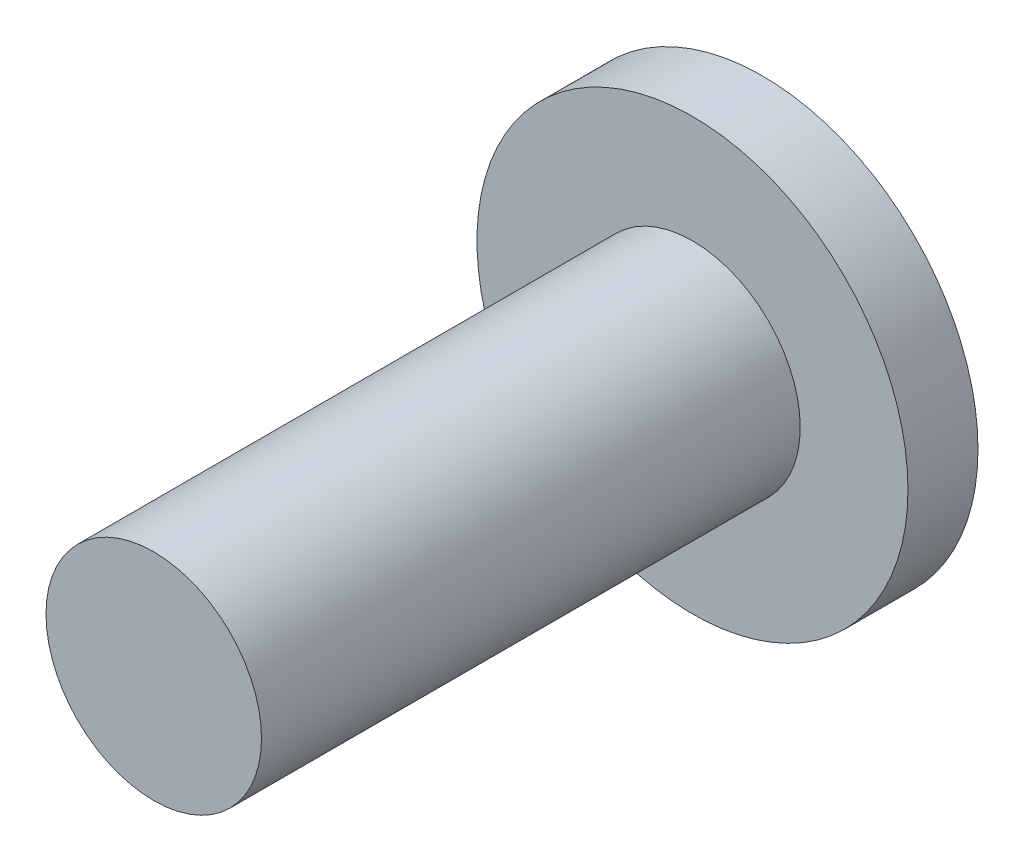
ISO-10303-21;
HEADER;
FILE_DESCRIPTION(('STEP AP214'),'2;1');
FILE_NAME('part.step','',(''),(''),'','','');
FILE_SCHEMA(('AUTOMOTIVE_DESIGN { 1 0 10303 214 1 1 1 1 }'));
ENDSEC;
DATA;
#1=APPLICATION_CONTEXT('core data for automotive mechanical design processes');
#2=APPLICATION_PROTOCOL_DEFINITION('international standard','automotive_design',2000,#1);
#3=PRODUCT_CONTEXT('',#1,'mechanical');
#4=PRODUCT('Part','Part','',(#3));
#5=PRODUCT_RELATED_PRODUCT_CATEGORY('part','',(#4));
#6=PRODUCT_DEFINITION_FORMATION('','',#4);
#7=PRODUCT_DEFINITION_CONTEXT('part definition',#1,'design');
#8=PRODUCT_DEFINITION('design','',#6,#7);
#9=PRODUCT_DEFINITION_SHAPE('','',#8);
#10=(LENGTH_UNIT() NAMED_UNIT(*) SI_UNIT(.MILLI.,.METRE.));
#11=(NAMED_UNIT(*) PLANE_ANGLE_UNIT() SI_UNIT($,.RADIAN.));
#12=(NAMED_UNIT(*) SI_UNIT($,.STERADIAN.) SOLID_ANGLE_UNIT());
#13=UNCERTAINTY_MEASURE_WITH_UNIT(LENGTH_MEASURE(1.E-05),#10,'distance_accuracy_value','');
#14=(GEOMETRIC_REPRESENTATION_CONTEXT(3) GLOBAL_UNCERTAINTY_ASSIGNED_CONTEXT((#13)) GLOBAL_UNIT_ASSIGNED_CONTEXT((#10,
#11,#12)) REPRESENTATION_CONTEXT('',''));
#15=CARTESIAN_POINT('',(0.,0.,0.));
#16=DIRECTION('',(0.,0.,1.));
#17=DIRECTION('',(1.,0.,0.));
#18=AXIS2_PLACEMENT_3D('',#15,#16,#17);
#19=CARTESIAN_POINT('',(0.,0.,1.3));
#20=DIRECTION('',(0.,0.,-1.));
#21=DIRECTION('',(-1.,0.,0.));
#22=AXIS2_PLACEMENT_3D('',#19,#20,#21);
#23=CYLINDRICAL_SURFACE('',#22,4.);
#24=CARTESIAN_POINT('',(0.,0.,1.3));
#25=DIRECTION('',(0.,0.,1.));
#26=DIRECTION('',(1.,0.,0.));
#27=AXIS2_PLACEMENT_3D('',#24,#25,#26);
#28=CIRCLE('',#27,4.);
#29=CARTESIAN_POINT('',(4.,0.,1.3));
#30=VERTEX_POINT('',#29);
#31=EDGE_CURVE('E51',#30,#30,#28,.T.);
#32=ORIENTED_EDGE('',*,*,#31,.F.);
#33=EDGE_LOOP('',(#32));
#34=FACE_BOUND('',#33,.T.);
#35=CARTESIAN_POINT('',(0.,0.,0.));
#36=DIRECTION('',(0.,0.,1.));
#37=DIRECTION('',(1.,0.,0.));
#38=AXIS2_PLACEMENT_3D('',#35,#36,#37);
#39=CIRCLE('',#38,4.);
#40=CARTESIAN_POINT('',(4.,0.,0.));
#41=VERTEX_POINT('',#40);
#42=EDGE_CURVE('E46',#41,#41,#39,.T.);
#43=ORIENTED_EDGE('',*,*,#42,.T.);
#44=EDGE_LOOP('',(#43));
#45=FACE_BOUND('',#44,.T.);
#46=ADVANCED_FACE('F43',(#34,#45),#23,.T.);
#47=CARTESIAN_POINT('',(0.,0.,1.3));
#48=DIRECTION('',(0.,0.,1.));
#49=DIRECTION('',(1.,0.,0.));
#50=AXIS2_PLACEMENT_3D('',#47,#48,#49);
#51=PLANE('',#50);
#52=CARTESIAN_POINT('',(0.,0.,1.3));
#53=DIRECTION('',(0.,0.,1.));
#54=DIRECTION('',(1.,0.,0.));
#55=AXIS2_PLACEMENT_3D('',#52,#53,#54);
#56=CIRCLE('',#55,2.);
#57=CARTESIAN_POINT('',(2.,0.,1.3));
#58=VERTEX_POINT('',#57);
#59=EDGE_CURVE('E11',#58,#58,#56,.T.);
#60=ORIENTED_EDGE('',*,*,#59,.F.);
#61=EDGE_LOOP('',(#60));
#62=FACE_BOUND('',#61,.T.);
#63=ORIENTED_EDGE('',*,*,#31,.T.);
#64=EDGE_LOOP('',(#63));
#65=FACE_BOUND('',#64,.T.);
#66=ADVANCED_FACE('F163',(#62,#65),#51,.T.);
#67=CARTESIAN_POINT('',(0.,0.,0.));
#68=DIRECTION('',(0.,0.,1.));
#69=DIRECTION('',(1.,0.,0.));
#70=AXIS2_PLACEMENT_3D('',#67,#68,#69);
#71=PLANE('',#70);
#72=DIRECTION('',(0.5,0.866025403784439,0.));
#73=VECTOR('',#72,1.);
#74=CARTESIAN_POINT('',(-1.44337567297406,0.,0.));
#75=LINE('',#74,#73);
#76=CARTESIAN_POINT('',(-1.44337567297406,0.,0.));
#77=VERTEX_POINT('',#76);
#78=CARTESIAN_POINT('',(-0.721687836487032,1.25,0.));
#79=VERTEX_POINT('',#78);
#80=EDGE_CURVE('E133',#77,#79,#75,.T.);
#81=ORIENTED_EDGE('',*,*,#80,.F.);
#82=DIRECTION('',(-0.5,0.866025403784439,0.));
#83=VECTOR('',#82,1.);
#84=CARTESIAN_POINT('',(-0.721687836487032,-1.25,0.));
#85=LINE('',#84,#83);
#86=CARTESIAN_POINT('',(-0.721687836487032,-1.25,0.));
#87=VERTEX_POINT('',#86);
#88=EDGE_CURVE('E59',#87,#77,#85,.T.);
#89=ORIENTED_EDGE('',*,*,#88,.F.);
#90=DIRECTION('',(-1.,0.,0.));
#91=VECTOR('',#90,1.);
#92=CARTESIAN_POINT('',(0.721687836487033,-1.25,0.));
#93=LINE('',#92,#91);
#94=CARTESIAN_POINT('',(0.721687836487033,-1.25,0.));
#95=VERTEX_POINT('',#94);
#96=EDGE_CURVE('E142',#95,#87,#93,.T.);
#97=ORIENTED_EDGE('',*,*,#96,.F.);
#98=DIRECTION('',(-0.5,-0.866025403784439,0.));
#99=VECTOR('',#98,1.);
#100=CARTESIAN_POINT('',(1.44337567297406,0.,0.));
#101=LINE('',#100,#99);
#102=CARTESIAN_POINT('',(1.44337567297406,0.,0.));
#103=VERTEX_POINT('',#102);
#104=EDGE_CURVE('E140',#103,#95,#101,.T.);
#105=ORIENTED_EDGE('',*,*,#104,.F.);
#106=DIRECTION('',(0.5,-0.866025403784439,0.));
#107=VECTOR('',#106,1.);
#108=CARTESIAN_POINT('',(0.721687836487033,1.25,0.));
#109=LINE('',#108,#107);
#110=CARTESIAN_POINT('',(0.721687836487033,1.25,0.));
#111=VERTEX_POINT('',#110);
#112=EDGE_CURVE('E107',#111,#103,#109,.T.);
#113=ORIENTED_EDGE('',*,*,#112,.F.);
#114=DIRECTION('',(1.,0.,0.));
#115=VECTOR('',#114,1.);
#116=CARTESIAN_POINT('',(-0.721687836487032,1.25,0.));
#117=LINE('',#116,#115);
#118=EDGE_CURVE('E136',#79,#111,#117,.T.);
#119=ORIENTED_EDGE('',*,*,#118,.F.);
#120=EDGE_LOOP('',(#81,#89,#97,#105,#113,#119));
#121=FACE_BOUND('',#120,.T.);
#122=ORIENTED_EDGE('',*,*,#42,.F.);
#123=EDGE_LOOP('',(#122));
#124=FACE_BOUND('',#123,.T.);
#125=ADVANCED_FACE('F160',(#121,#124),#71,.F.);
#126=CARTESIAN_POINT('',(0.,0.,11.3));
#127=DIRECTION('',(0.,0.,-1.));
#128=DIRECTION('',(-1.,0.,0.));
#129=AXIS2_PLACEMENT_3D('',#126,#127,#128);
#130=CYLINDRICAL_SURFACE('',#129,2.);
#131=CARTESIAN_POINT('',(0.,0.,11.3));
#132=DIRECTION('',(0.,0.,1.));
#133=DIRECTION('',(1.,0.,0.));
#134=AXIS2_PLACEMENT_3D('',#131,#132,#133);
#135=CIRCLE('',#134,2.);
#136=CARTESIAN_POINT('',(2.,0.,11.3));
#137=VERTEX_POINT('',#136);
#138=EDGE_CURVE('E146',#137,#137,#135,.T.);
#139=ORIENTED_EDGE('',*,*,#138,.F.);
#140=EDGE_LOOP('',(#139));
#141=FACE_BOUND('',#140,.T.);
#142=ORIENTED_EDGE('',*,*,#59,.T.);
#143=EDGE_LOOP('',(#142));
#144=FACE_BOUND('',#143,.T.);
#145=ADVANCED_FACE('F162',(#141,#144),#130,.T.);
#146=CARTESIAN_POINT('',(0.,0.,11.3));
#147=DIRECTION('',(0.,0.,1.));
#148=DIRECTION('',(1.,0.,0.));
#149=AXIS2_PLACEMENT_3D('',#146,#147,#148);
#150=PLANE('',#149);
#151=ORIENTED_EDGE('',*,*,#138,.T.);
#152=EDGE_LOOP('',(#151));
#153=FACE_BOUND('',#152,.T.);
#154=ADVANCED_FACE('F170',(#153),#150,.T.);
#155=CARTESIAN_POINT('',(-0.721687836487032,-1.25,1.));
#156=DIRECTION('',(-0.866025403784439,-0.5,0.));
#157=DIRECTION('',(0.5,-0.866025403784439,0.));
#158=AXIS2_PLACEMENT_3D('',#155,#156,#157);
#159=PLANE('',#158);
#160=ORIENTED_EDGE('',*,*,#88,.T.);
#161=DIRECTION('',(0.,0.,-1.));
#162=VECTOR('',#161,1.);
#163=CARTESIAN_POINT('',(-1.44337567297406,0.,1.));
#164=LINE('',#163,#162);
#165=CARTESIAN_POINT('',(-1.44337567297406,0.,1.));
#166=VERTEX_POINT('',#165);
#167=EDGE_CURVE('E89',#166,#77,#164,.T.);
#168=ORIENTED_EDGE('',*,*,#167,.F.);
#169=DIRECTION('',(-0.5,0.866025403784439,0.));
#170=VECTOR('',#169,1.);
#171=CARTESIAN_POINT('',(-0.721687836487032,-1.25,1.));
#172=LINE('',#171,#170);
#173=CARTESIAN_POINT('',(-0.721687836487032,-1.25,1.));
#174=VERTEX_POINT('',#173);
#175=EDGE_CURVE('E144',#174,#166,#172,.T.);
#176=ORIENTED_EDGE('',*,*,#175,.F.);
#177=DIRECTION('',(0.,0.,-1.));
#178=VECTOR('',#177,1.);
#179=CARTESIAN_POINT('',(-0.721687836487032,-1.25,1.));
#180=LINE('',#179,#178);
#181=EDGE_CURVE('E67',#174,#87,#180,.T.);
#182=ORIENTED_EDGE('',*,*,#181,.T.);
#183=EDGE_LOOP('',(#160,#168,#176,#182));
#184=FACE_BOUND('',#183,.T.);
#185=ADVANCED_FACE('F196',(#184),#159,.F.);
#186=CARTESIAN_POINT('',(0.721687836487033,-1.25,1.));
#187=DIRECTION('',(0.,-1.,0.));
#188=DIRECTION('',(0.,0.,-1.));
#189=AXIS2_PLACEMENT_3D('',#186,#187,#188);
#190=PLANE('',#189);
#191=ORIENTED_EDGE('',*,*,#96,.T.);
#192=ORIENTED_EDGE('',*,*,#181,.F.);
#193=DIRECTION('',(-1.,0.,0.));
#194=VECTOR('',#193,1.);
#195=CARTESIAN_POINT('',(0.721687836487033,-1.25,1.));
#196=LINE('',#195,#194);
#197=CARTESIAN_POINT('',(0.721687836487033,-1.25,1.));
#198=VERTEX_POINT('',#197);
#199=EDGE_CURVE('E119',#198,#174,#196,.T.);
#200=ORIENTED_EDGE('',*,*,#199,.F.);
#201=DIRECTION('',(0.,0.,-1.));
#202=VECTOR('',#201,1.);
#203=CARTESIAN_POINT('',(0.721687836487033,-1.25,1.));
#204=LINE('',#203,#202);
#205=EDGE_CURVE('E111',#198,#95,#204,.T.);
#206=ORIENTED_EDGE('',*,*,#205,.T.);
#207=EDGE_LOOP('',(#191,#192,#200,#206));
#208=FACE_BOUND('',#207,.T.);
#209=ADVANCED_FACE('F208',(#208),#190,.F.);
#210=CARTESIAN_POINT('',(1.44337567297406,0.,1.));
#211=DIRECTION('',(0.866025403784439,-0.5,0.));
#212=DIRECTION('',(0.5,0.866025403784439,0.));
#213=AXIS2_PLACEMENT_3D('',#210,#211,#212);
#214=PLANE('',#213);
#215=ORIENTED_EDGE('',*,*,#104,.T.);
#216=ORIENTED_EDGE('',*,*,#205,.F.);
#217=DIRECTION('',(-0.5,-0.866025403784439,0.));
#218=VECTOR('',#217,1.);
#219=CARTESIAN_POINT('',(1.44337567297406,0.,1.));
#220=LINE('',#219,#218);
#221=CARTESIAN_POINT('',(1.44337567297406,0.,1.));
#222=VERTEX_POINT('',#221);
#223=EDGE_CURVE('E115',#222,#198,#220,.T.);
#224=ORIENTED_EDGE('',*,*,#223,.F.);
#225=DIRECTION('',(0.,0.,-1.));
#226=VECTOR('',#225,1.);
#227=CARTESIAN_POINT('',(1.44337567297406,0.,1.));
#228=LINE('',#227,#226);
#229=EDGE_CURVE('E100',#222,#103,#228,.T.);
#230=ORIENTED_EDGE('',*,*,#229,.T.);
#231=EDGE_LOOP('',(#215,#216,#224,#230));
#232=FACE_BOUND('',#231,.T.);
#233=ADVANCED_FACE('F116',(#232),#214,.F.);
#234=CARTESIAN_POINT('',(0.721687836487033,1.25,1.));
#235=DIRECTION('',(0.866025403784439,0.5,0.));
#236=DIRECTION('',(-0.5,0.866025403784439,0.));
#237=AXIS2_PLACEMENT_3D('',#234,#235,#236);
#238=PLANE('',#237);
#239=ORIENTED_EDGE('',*,*,#112,.T.);
#240=ORIENTED_EDGE('',*,*,#229,.F.);
#241=DIRECTION('',(0.5,-0.866025403784439,0.));
#242=VECTOR('',#241,1.);
#243=CARTESIAN_POINT('',(0.721687836487033,1.25,1.));
#244=LINE('',#243,#242);
#245=CARTESIAN_POINT('',(0.721687836487033,1.25,1.));
#246=VERTEX_POINT('',#245);
#247=EDGE_CURVE('E104',#246,#222,#244,.T.);
#248=ORIENTED_EDGE('',*,*,#247,.F.);
#249=DIRECTION('',(0.,0.,-1.));
#250=VECTOR('',#249,1.);
#251=CARTESIAN_POINT('',(0.721687836487033,1.25,1.));
#252=LINE('',#251,#250);
#253=EDGE_CURVE('E112',#246,#111,#252,.T.);
#254=ORIENTED_EDGE('',*,*,#253,.T.);
#255=EDGE_LOOP('',(#239,#240,#248,#254));
#256=FACE_BOUND('',#255,.T.);
#257=ADVANCED_FACE('F102',(#256),#238,.F.);
#258=CARTESIAN_POINT('',(-0.721687836487032,1.25,1.));
#259=DIRECTION('',(0.,1.,0.));
#260=DIRECTION('',(0.,0.,1.));
#261=AXIS2_PLACEMENT_3D('',#258,#259,#260);
#262=PLANE('',#261);
#263=ORIENTED_EDGE('',*,*,#118,.T.);
#264=ORIENTED_EDGE('',*,*,#253,.F.);
#265=DIRECTION('',(1.,0.,0.));
#266=VECTOR('',#265,1.);
#267=CARTESIAN_POINT('',(-0.721687836487032,1.25,1.));
#268=LINE('',#267,#266);
#269=CARTESIAN_POINT('',(-0.721687836487032,1.25,1.));
#270=VERTEX_POINT('',#269);
#271=EDGE_CURVE('E125',#270,#246,#268,.T.);
#272=ORIENTED_EDGE('',*,*,#271,.F.);
#273=DIRECTION('',(0.,0.,-1.));
#274=VECTOR('',#273,1.);
#275=CARTESIAN_POINT('',(-0.721687836487032,1.25,1.));
#276=LINE('',#275,#274);
#277=EDGE_CURVE('E149',#270,#79,#276,.T.);
#278=ORIENTED_EDGE('',*,*,#277,.T.);
#279=EDGE_LOOP('',(#263,#264,#272,#278));
#280=FACE_BOUND('',#279,.T.);
#281=ADVANCED_FACE('F233',(#280),#262,.F.);
#282=CARTESIAN_POINT('',(-1.44337567297406,0.,1.));
#283=DIRECTION('',(-0.866025403784439,0.5,0.));
#284=DIRECTION('',(-0.5,-0.866025403784439,0.));
#285=AXIS2_PLACEMENT_3D('',#282,#283,#284);
#286=PLANE('',#285);
#287=ORIENTED_EDGE('',*,*,#80,.T.);
#288=ORIENTED_EDGE('',*,*,#277,.F.);
#289=DIRECTION('',(0.5,0.866025403784439,0.));
#290=VECTOR('',#289,1.);
#291=CARTESIAN_POINT('',(-1.44337567297406,0.,1.));
#292=LINE('',#291,#290);
#293=EDGE_CURVE('E127',#166,#270,#292,.T.);
#294=ORIENTED_EDGE('',*,*,#293,.F.);
#295=ORIENTED_EDGE('',*,*,#167,.T.);
#296=EDGE_LOOP('',(#287,#288,#294,#295));
#297=FACE_BOUND('',#296,.T.);
#298=ADVANCED_FACE('F242',(#297),#286,.F.);
#299=CARTESIAN_POINT('',(0.,0.,1.));
#300=DIRECTION('',(0.,0.,-1.));
#301=DIRECTION('',(-1.,0.,0.));
#302=AXIS2_PLACEMENT_3D('',#299,#300,#301);
#303=PLANE('',#302);
#304=ORIENTED_EDGE('',*,*,#175,.T.);
#305=ORIENTED_EDGE('',*,*,#293,.T.);
#306=ORIENTED_EDGE('',*,*,#271,.T.);
#307=ORIENTED_EDGE('',*,*,#247,.T.);
#308=ORIENTED_EDGE('',*,*,#223,.T.);
#309=ORIENTED_EDGE('',*,*,#199,.T.);
#310=EDGE_LOOP('',(#304,#305,#306,#307,#308,#309));
#311=FACE_BOUND('',#310,.T.);
#312=ADVANCED_FACE('F122',(#311),#303,.T.);
#313=CLOSED_SHELL('',(#46,#66,#125,#145,#154,#185,#209,#233,#257,#281,#298,#312));
#314=MANIFOLD_SOLID_BREP('B2',#313);
#315=ADVANCED_BREP_SHAPE_REPRESENTATION('',(#18,#314),#14);
#316=SHAPE_DEFINITION_REPRESENTATION(#9,#315);
ENDSEC;
END-ISO-10303-21;
